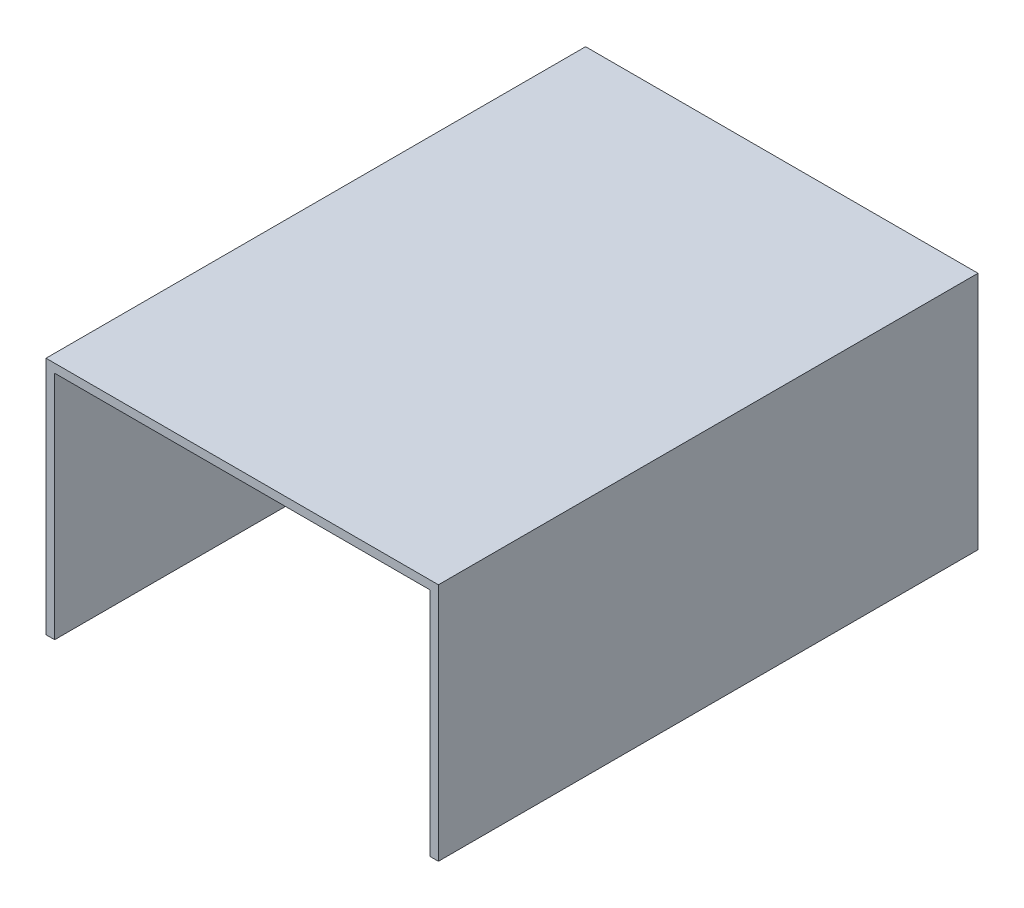
ISO-10303-21;
HEADER;
FILE_DESCRIPTION(('STEP AP214'),'2;1');
FILE_NAME('part.step','',(''),(''),'','','');
FILE_SCHEMA(('AUTOMOTIVE_DESIGN { 1 0 10303 214 1 1 1 1 }'));
ENDSEC;
DATA;
#1=APPLICATION_CONTEXT('core data for automotive mechanical design processes');
#2=APPLICATION_PROTOCOL_DEFINITION('international standard','automotive_design',2000,#1);
#3=PRODUCT_CONTEXT('',#1,'mechanical');
#4=PRODUCT('Part','Part','',(#3));
#5=PRODUCT_RELATED_PRODUCT_CATEGORY('part','',(#4));
#6=PRODUCT_DEFINITION_FORMATION('','',#4);
#7=PRODUCT_DEFINITION_CONTEXT('part definition',#1,'design');
#8=PRODUCT_DEFINITION('design','',#6,#7);
#9=PRODUCT_DEFINITION_SHAPE('','',#8);
#10=(LENGTH_UNIT() NAMED_UNIT(*) SI_UNIT(.MILLI.,.METRE.));
#11=(NAMED_UNIT(*) PLANE_ANGLE_UNIT() SI_UNIT($,.RADIAN.));
#12=(NAMED_UNIT(*) SI_UNIT($,.STERADIAN.) SOLID_ANGLE_UNIT());
#13=UNCERTAINTY_MEASURE_WITH_UNIT(LENGTH_MEASURE(1.E-05),#10,'distance_accuracy_value','');
#14=(GEOMETRIC_REPRESENTATION_CONTEXT(3) GLOBAL_UNCERTAINTY_ASSIGNED_CONTEXT((#13)) GLOBAL_UNIT_ASSIGNED_CONTEXT((#10,
#11,#12)) REPRESENTATION_CONTEXT('',''));
#15=CARTESIAN_POINT('',(0.,0.,0.));
#16=DIRECTION('',(0.,0.,1.));
#17=DIRECTION('',(1.,0.,0.));
#18=AXIS2_PLACEMENT_3D('',#15,#16,#17);
#19=CARTESIAN_POINT('',(6.8,-4.15,18.7));
#20=DIRECTION('',(0.,-1.,0.));
#21=DIRECTION('',(1.,0.,0.));
#22=AXIS2_PLACEMENT_3D('',#19,#20,#21);
#23=PLANE('',#22);
#24=DIRECTION('',(1.,0.,0.));
#25=VECTOR('',#24,1.);
#26=CARTESIAN_POINT('',(-6.5,-4.15,0.599999999999996));
#27=LINE('',#26,#25);
#28=CARTESIAN_POINT('',(-6.5,-4.15,0.599999999999996));
#29=VERTEX_POINT('',#28);
#30=CARTESIAN_POINT('',(6.5,-4.15,0.599999999999996));
#31=VERTEX_POINT('',#30);
#32=EDGE_CURVE('E125',#29,#31,#27,.T.);
#33=ORIENTED_EDGE('',*,*,#32,.F.);
#34=DIRECTION('',(0.,0.,-1.));
#35=VECTOR('',#34,1.);
#36=CARTESIAN_POINT('',(-6.5,-4.15,18.700012));
#37=LINE('',#36,#35);
#38=CARTESIAN_POINT('',(-6.5,-4.15,18.7));
#39=VERTEX_POINT('',#38);
#40=EDGE_CURVE('E117',#39,#29,#37,.T.);
#41=ORIENTED_EDGE('',*,*,#40,.F.);
#42=DIRECTION('',(-1.,0.,0.));
#43=VECTOR('',#42,1.);
#44=CARTESIAN_POINT('',(6.8,-4.15,18.7));
#45=LINE('',#44,#43);
#46=CARTESIAN_POINT('',(-6.8,-4.15,18.7));
#47=VERTEX_POINT('',#46);
#48=EDGE_CURVE('E146',#39,#47,#45,.T.);
#49=ORIENTED_EDGE('',*,*,#48,.T.);
#50=DIRECTION('',(0.,0.,-1.));
#51=VECTOR('',#50,1.);
#52=CARTESIAN_POINT('',(-6.8,-4.15,18.7));
#53=LINE('',#52,#51);
#54=CARTESIAN_POINT('',(-6.8,-4.15,0.));
#55=VERTEX_POINT('',#54);
#56=EDGE_CURVE('E164',#47,#55,#53,.T.);
#57=ORIENTED_EDGE('',*,*,#56,.T.);
#58=DIRECTION('',(-1.,0.,0.));
#59=VECTOR('',#58,1.);
#60=CARTESIAN_POINT('',(6.8,-4.15,0.));
#61=LINE('',#60,#59);
#62=CARTESIAN_POINT('',(6.8,-4.15,0.));
#63=VERTEX_POINT('',#62);
#64=EDGE_CURVE('E157',#63,#55,#61,.T.);
#65=ORIENTED_EDGE('',*,*,#64,.F.);
#66=DIRECTION('',(0.,0.,-1.));
#67=VECTOR('',#66,1.);
#68=CARTESIAN_POINT('',(6.8,-4.15,18.7));
#69=LINE('',#68,#67);
#70=CARTESIAN_POINT('',(6.8,-4.15,18.7));
#71=VERTEX_POINT('',#70);
#72=EDGE_CURVE('E162',#71,#63,#69,.T.);
#73=ORIENTED_EDGE('',*,*,#72,.F.);
#74=CARTESIAN_POINT('',(6.5,-4.15,18.7));
#75=VERTEX_POINT('',#74);
#76=EDGE_CURVE('E147',#71,#75,#45,.T.);
#77=ORIENTED_EDGE('',*,*,#76,.T.);
#78=DIRECTION('',(0.,0.,-1.));
#79=VECTOR('',#78,1.);
#80=CARTESIAN_POINT('',(6.5,-4.15,18.700012));
#81=LINE('',#80,#79);
#82=EDGE_CURVE('E47',#75,#31,#81,.T.);
#83=ORIENTED_EDGE('',*,*,#82,.T.);
#84=EDGE_LOOP('',(#33,#41,#49,#57,#65,#73,#77,#83));
#85=FACE_BOUND('',#84,.T.);
#86=ADVANCED_FACE('F32',(#85),#23,.T.);
#87=CARTESIAN_POINT('',(0.,0.,18.7));
#88=DIRECTION('',(0.,0.,-1.));
#89=DIRECTION('',(-1.,0.,0.));
#90=AXIS2_PLACEMENT_3D('',#87,#88,#89);
#91=PLANE('',#90);
#92=DIRECTION('',(0.,-1.,0.));
#93=VECTOR('',#92,1.);
#94=CARTESIAN_POINT('',(-6.5,0.,18.7));
#95=LINE('',#94,#93);
#96=CARTESIAN_POINT('',(-6.5,3.85,18.7));
#97=VERTEX_POINT('',#96);
#98=EDGE_CURVE('E11',#97,#39,#95,.T.);
#99=ORIENTED_EDGE('',*,*,#98,.F.);
#100=DIRECTION('',(-1.,0.,0.));
#101=VECTOR('',#100,1.);
#102=CARTESIAN_POINT('',(0.,3.85,18.7));
#103=LINE('',#102,#101);
#104=CARTESIAN_POINT('',(6.5,3.85,18.7));
#105=VERTEX_POINT('',#104);
#106=EDGE_CURVE('E40',#105,#97,#103,.T.);
#107=ORIENTED_EDGE('',*,*,#106,.F.);
#108=DIRECTION('',(0.,1.,0.));
#109=VECTOR('',#108,1.);
#110=CARTESIAN_POINT('',(6.5,0.,18.7));
#111=LINE('',#110,#109);
#112=EDGE_CURVE('E168',#75,#105,#111,.T.);
#113=ORIENTED_EDGE('',*,*,#112,.F.);
#114=ORIENTED_EDGE('',*,*,#76,.F.);
#115=DIRECTION('',(0.,1.,0.));
#116=VECTOR('',#115,1.);
#117=CARTESIAN_POINT('',(6.8,-4.15,18.7));
#118=LINE('',#117,#116);
#119=CARTESIAN_POINT('',(6.8,4.15,18.7));
#120=VERTEX_POINT('',#119);
#121=EDGE_CURVE('E56',#71,#120,#118,.T.);
#122=ORIENTED_EDGE('',*,*,#121,.T.);
#123=DIRECTION('',(-1.,0.,0.));
#124=VECTOR('',#123,1.);
#125=CARTESIAN_POINT('',(6.8,4.15,18.7));
#126=LINE('',#125,#124);
#127=CARTESIAN_POINT('',(-6.8,4.15,18.7));
#128=VERTEX_POINT('',#127);
#129=EDGE_CURVE('E82',#120,#128,#126,.T.);
#130=ORIENTED_EDGE('',*,*,#129,.T.);
#131=DIRECTION('',(0.,1.,0.));
#132=VECTOR('',#131,1.);
#133=CARTESIAN_POINT('',(-6.8,-4.15,18.7));
#134=LINE('',#133,#132);
#135=EDGE_CURVE('E143',#47,#128,#134,.T.);
#136=ORIENTED_EDGE('',*,*,#135,.F.);
#137=ORIENTED_EDGE('',*,*,#48,.F.);
#138=EDGE_LOOP('',(#99,#107,#113,#114,#122,#130,#136,#137));
#139=FACE_BOUND('',#138,.T.);
#140=ADVANCED_FACE('F170',(#139),#91,.F.);
#141=CARTESIAN_POINT('',(6.8,4.15,18.7));
#142=DIRECTION('',(0.,-1.,0.));
#143=DIRECTION('',(1.,0.,0.));
#144=AXIS2_PLACEMENT_3D('',#141,#142,#143);
#145=PLANE('',#144);
#146=DIRECTION('',(-1.,0.,0.));
#147=VECTOR('',#146,1.);
#148=CARTESIAN_POINT('',(6.8,4.15,0.));
#149=LINE('',#148,#147);
#150=CARTESIAN_POINT('',(6.8,4.15,0.));
#151=VERTEX_POINT('',#150);
#152=CARTESIAN_POINT('',(-6.8,4.15,0.));
#153=VERTEX_POINT('',#152);
#154=EDGE_CURVE('E116',#151,#153,#149,.T.);
#155=ORIENTED_EDGE('',*,*,#154,.T.);
#156=DIRECTION('',(0.,0.,-1.));
#157=VECTOR('',#156,1.);
#158=CARTESIAN_POINT('',(-6.8,4.15,18.7));
#159=LINE('',#158,#157);
#160=EDGE_CURVE('E166',#128,#153,#159,.T.);
#161=ORIENTED_EDGE('',*,*,#160,.F.);
#162=ORIENTED_EDGE('',*,*,#129,.F.);
#163=DIRECTION('',(0.,0.,-1.));
#164=VECTOR('',#163,1.);
#165=CARTESIAN_POINT('',(6.8,4.15,18.7));
#166=LINE('',#165,#164);
#167=EDGE_CURVE('E151',#120,#151,#166,.T.);
#168=ORIENTED_EDGE('',*,*,#167,.T.);
#169=EDGE_LOOP('',(#155,#161,#162,#168));
#170=FACE_BOUND('',#169,.T.);
#171=ADVANCED_FACE('F34',(#170),#145,.F.);
#172=CARTESIAN_POINT('',(-6.8,-4.15,18.7));
#173=DIRECTION('',(-1.,0.,0.));
#174=DIRECTION('',(0.,0.,1.));
#175=AXIS2_PLACEMENT_3D('',#172,#173,#174);
#176=PLANE('',#175);
#177=DIRECTION('',(0.,1.,0.));
#178=VECTOR('',#177,1.);
#179=CARTESIAN_POINT('',(-6.8,-4.15,0.));
#180=LINE('',#179,#178);
#181=EDGE_CURVE('E154',#55,#153,#180,.T.);
#182=ORIENTED_EDGE('',*,*,#181,.F.);
#183=ORIENTED_EDGE('',*,*,#56,.F.);
#184=ORIENTED_EDGE('',*,*,#135,.T.);
#185=ORIENTED_EDGE('',*,*,#160,.T.);
#186=EDGE_LOOP('',(#182,#183,#184,#185));
#187=FACE_BOUND('',#186,.T.);
#188=ADVANCED_FACE('F180',(#187),#176,.T.);
#189=CARTESIAN_POINT('',(6.8,-4.15,18.7));
#190=DIRECTION('',(-1.,0.,0.));
#191=DIRECTION('',(0.,0.,1.));
#192=AXIS2_PLACEMENT_3D('',#189,#190,#191);
#193=PLANE('',#192);
#194=DIRECTION('',(0.,1.,0.));
#195=VECTOR('',#194,1.);
#196=CARTESIAN_POINT('',(6.8,-4.15,0.));
#197=LINE('',#196,#195);
#198=EDGE_CURVE('E77',#63,#151,#197,.T.);
#199=ORIENTED_EDGE('',*,*,#198,.T.);
#200=ORIENTED_EDGE('',*,*,#167,.F.);
#201=ORIENTED_EDGE('',*,*,#121,.F.);
#202=ORIENTED_EDGE('',*,*,#72,.T.);
#203=EDGE_LOOP('',(#199,#200,#201,#202));
#204=FACE_BOUND('',#203,.T.);
#205=ADVANCED_FACE('F175',(#204),#193,.F.);
#206=CARTESIAN_POINT('',(0.,0.,0.));
#207=DIRECTION('',(0.,0.,-1.));
#208=DIRECTION('',(-1.,0.,0.));
#209=AXIS2_PLACEMENT_3D('',#206,#207,#208);
#210=PLANE('',#209);
#211=CARTESIAN_POINT('',(0.,0.,0.));
#212=DIRECTION('',(0.,0.,-1.));
#213=DIRECTION('',(-1.,0.,0.));
#214=AXIS2_PLACEMENT_3D('',#211,#212,#213);
#215=CIRCLE('',#214,1.4);
#216=CARTESIAN_POINT('',(-1.4,0.,0.));
#217=VERTEX_POINT('',#216);
#218=EDGE_CURVE('E129',#217,#217,#215,.T.);
#219=ORIENTED_EDGE('',*,*,#218,.F.);
#220=EDGE_LOOP('',(#219));
#221=FACE_BOUND('',#220,.T.);
#222=ORIENTED_EDGE('',*,*,#154,.F.);
#223=ORIENTED_EDGE('',*,*,#198,.F.);
#224=ORIENTED_EDGE('',*,*,#64,.T.);
#225=ORIENTED_EDGE('',*,*,#181,.T.);
#226=EDGE_LOOP('',(#222,#223,#224,#225));
#227=FACE_BOUND('',#226,.T.);
#228=ADVANCED_FACE('F182',(#221,#227),#210,.T.);
#229=CARTESIAN_POINT('',(6.5,3.85,18.700012));
#230=DIRECTION('',(0.,-1.,0.));
#231=DIRECTION('',(1.,0.,0.));
#232=AXIS2_PLACEMENT_3D('',#229,#230,#231);
#233=PLANE('',#232);
#234=ORIENTED_EDGE('',*,*,#106,.T.);
#235=DIRECTION('',(0.,0.,-1.));
#236=VECTOR('',#235,1.);
#237=CARTESIAN_POINT('',(-6.5,3.85,18.700012));
#238=LINE('',#237,#236);
#239=CARTESIAN_POINT('',(-6.5,3.85,0.599999999999996));
#240=VERTEX_POINT('',#239);
#241=EDGE_CURVE('E106',#97,#240,#238,.T.);
#242=ORIENTED_EDGE('',*,*,#241,.T.);
#243=DIRECTION('',(-1.,0.,0.));
#244=VECTOR('',#243,1.);
#245=CARTESIAN_POINT('',(6.5,3.85,0.599999999999996));
#246=LINE('',#245,#244);
#247=CARTESIAN_POINT('',(6.5,3.85,0.599999999999996));
#248=VERTEX_POINT('',#247);
#249=EDGE_CURVE('E111',#248,#240,#246,.T.);
#250=ORIENTED_EDGE('',*,*,#249,.F.);
#251=DIRECTION('',(0.,0.,-1.));
#252=VECTOR('',#251,1.);
#253=CARTESIAN_POINT('',(6.5,3.85,18.700012));
#254=LINE('',#253,#252);
#255=EDGE_CURVE('E138',#105,#248,#254,.T.);
#256=ORIENTED_EDGE('',*,*,#255,.F.);
#257=EDGE_LOOP('',(#234,#242,#250,#256));
#258=FACE_BOUND('',#257,.T.);
#259=ADVANCED_FACE('F108',(#258),#233,.T.);
#260=CARTESIAN_POINT('',(-6.5,3.85,18.700012));
#261=DIRECTION('',(1.,0.,0.));
#262=DIRECTION('',(0.,0.,-1.));
#263=AXIS2_PLACEMENT_3D('',#260,#261,#262);
#264=PLANE('',#263);
#265=ORIENTED_EDGE('',*,*,#98,.T.);
#266=ORIENTED_EDGE('',*,*,#40,.T.);
#267=DIRECTION('',(0.,-1.,0.));
#268=VECTOR('',#267,1.);
#269=CARTESIAN_POINT('',(-6.5,3.85,0.599999999999996));
#270=LINE('',#269,#268);
#271=EDGE_CURVE('E120',#240,#29,#270,.T.);
#272=ORIENTED_EDGE('',*,*,#271,.F.);
#273=ORIENTED_EDGE('',*,*,#241,.F.);
#274=EDGE_LOOP('',(#265,#266,#272,#273));
#275=FACE_BOUND('',#274,.T.);
#276=ADVANCED_FACE('F121',(#275),#264,.T.);
#277=CARTESIAN_POINT('',(6.5,-4.15,18.700012));
#278=DIRECTION('',(-1.,0.,0.));
#279=DIRECTION('',(0.,0.,1.));
#280=AXIS2_PLACEMENT_3D('',#277,#278,#279);
#281=PLANE('',#280);
#282=ORIENTED_EDGE('',*,*,#112,.T.);
#283=ORIENTED_EDGE('',*,*,#255,.T.);
#284=DIRECTION('',(0.,1.,0.));
#285=VECTOR('',#284,1.);
#286=CARTESIAN_POINT('',(6.5,-4.15,0.599999999999996));
#287=LINE('',#286,#285);
#288=EDGE_CURVE('E128',#31,#248,#287,.T.);
#289=ORIENTED_EDGE('',*,*,#288,.F.);
#290=ORIENTED_EDGE('',*,*,#82,.F.);
#291=EDGE_LOOP('',(#282,#283,#289,#290));
#292=FACE_BOUND('',#291,.T.);
#293=ADVANCED_FACE('F169',(#292),#281,.T.);
#294=CARTESIAN_POINT('',(0.,0.,0.599999999999996));
#295=DIRECTION('',(0.,0.,1.));
#296=DIRECTION('',(1.,0.,0.));
#297=AXIS2_PLACEMENT_3D('',#294,#295,#296);
#298=PLANE('',#297);
#299=CARTESIAN_POINT('',(0.,0.,0.599999999999996));
#300=DIRECTION('',(0.,0.,1.));
#301=DIRECTION('',(1.,0.,0.));
#302=AXIS2_PLACEMENT_3D('',#299,#300,#301);
#303=CIRCLE('',#302,1.4);
#304=CARTESIAN_POINT('',(1.4,0.,0.599999999999996));
#305=VERTEX_POINT('',#304);
#306=EDGE_CURVE('E132',#305,#305,#303,.F.);
#307=ORIENTED_EDGE('',*,*,#306,.T.);
#308=EDGE_LOOP('',(#307));
#309=FACE_BOUND('',#308,.T.);
#310=ORIENTED_EDGE('',*,*,#249,.T.);
#311=ORIENTED_EDGE('',*,*,#271,.T.);
#312=ORIENTED_EDGE('',*,*,#32,.T.);
#313=ORIENTED_EDGE('',*,*,#288,.T.);
#314=EDGE_LOOP('',(#310,#311,#312,#313));
#315=FACE_BOUND('',#314,.T.);
#316=ADVANCED_FACE('F127',(#309,#315),#298,.T.);
#317=CARTESIAN_POINT('',(0.,0.,18.701));
#318=DIRECTION('',(0.,0.,-1.));
#319=DIRECTION('',(-1.,0.,0.));
#320=AXIS2_PLACEMENT_3D('',#317,#318,#319);
#321=CYLINDRICAL_SURFACE('',#320,1.4);
#322=ORIENTED_EDGE('',*,*,#306,.F.);
#323=EDGE_LOOP('',(#322));
#324=FACE_BOUND('',#323,.T.);
#325=ORIENTED_EDGE('',*,*,#218,.T.);
#326=EDGE_LOOP('',(#325));
#327=FACE_BOUND('',#326,.T.);
#328=ADVANCED_FACE('F248',(#324,#327),#321,.F.);
#329=CLOSED_SHELL('',(#86,#140,#171,#188,#205,#228,#259,#276,#293,#316,#328));
#330=MANIFOLD_SOLID_BREP('B2',#329);
#331=ADVANCED_BREP_SHAPE_REPRESENTATION('',(#18,#330),#14);
#332=SHAPE_DEFINITION_REPRESENTATION(#9,#331);
ENDSEC;
END-ISO-10303-21;
